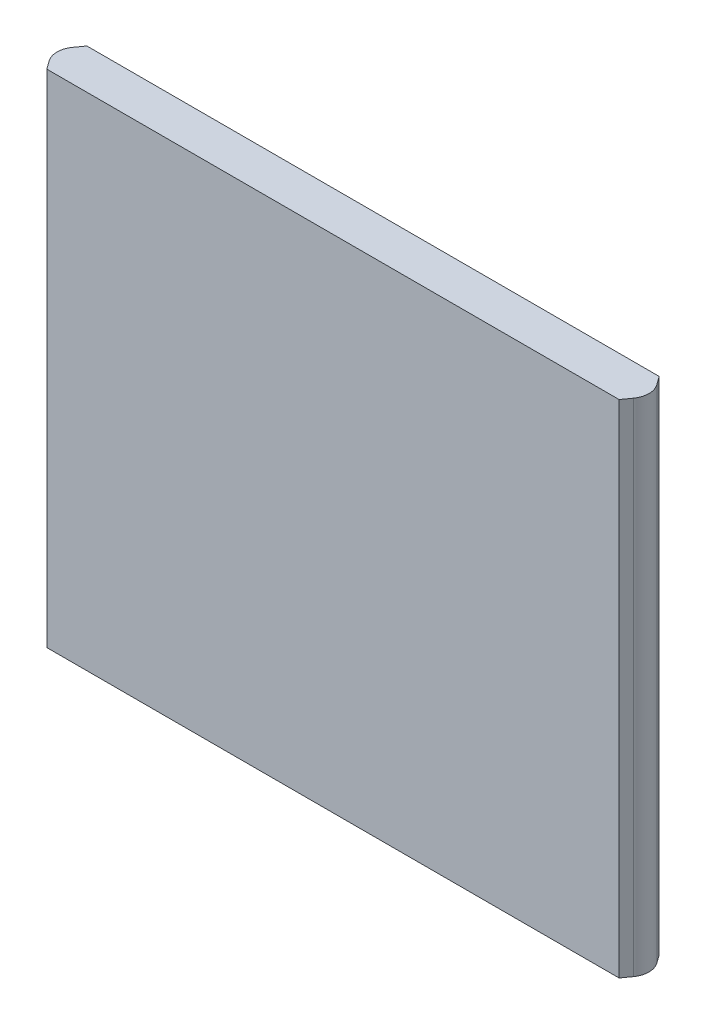
ISO-10303-21;
HEADER;
FILE_DESCRIPTION(('STEP AP214'),'2;1');
FILE_NAME('part.step','',(''),(''),'','','');
FILE_SCHEMA(('AUTOMOTIVE_DESIGN { 1 0 10303 214 1 1 1 1 }'));
ENDSEC;
DATA;
#1=APPLICATION_CONTEXT('core data for automotive mechanical design processes');
#2=APPLICATION_PROTOCOL_DEFINITION('international standard','automotive_design',2000,#1);
#3=PRODUCT_CONTEXT('',#1,'mechanical');
#4=PRODUCT('Part','Part','',(#3));
#5=PRODUCT_RELATED_PRODUCT_CATEGORY('part','',(#4));
#6=PRODUCT_DEFINITION_FORMATION('','',#4);
#7=PRODUCT_DEFINITION_CONTEXT('part definition',#1,'design');
#8=PRODUCT_DEFINITION('design','',#6,#7);
#9=PRODUCT_DEFINITION_SHAPE('','',#8);
#10=(LENGTH_UNIT() NAMED_UNIT(*) SI_UNIT(.MILLI.,.METRE.));
#11=(NAMED_UNIT(*) PLANE_ANGLE_UNIT() SI_UNIT($,.RADIAN.));
#12=(NAMED_UNIT(*) SI_UNIT($,.STERADIAN.) SOLID_ANGLE_UNIT());
#13=UNCERTAINTY_MEASURE_WITH_UNIT(LENGTH_MEASURE(1.E-05),#10,'distance_accuracy_value','');
#14=(GEOMETRIC_REPRESENTATION_CONTEXT(3) GLOBAL_UNCERTAINTY_ASSIGNED_CONTEXT((#13)) GLOBAL_UNIT_ASSIGNED_CONTEXT((#10,
#11,#12)) REPRESENTATION_CONTEXT('',''));
#15=CARTESIAN_POINT('',(0.,0.,0.));
#16=DIRECTION('',(0.,0.,1.));
#17=DIRECTION('',(1.,0.,0.));
#18=AXIS2_PLACEMENT_3D('',#15,#16,#17);
#19=CARTESIAN_POINT('',(30.,0.,2.));
#20=DIRECTION('',(0.,-1.,0.));
#21=DIRECTION('',(0.,0.,-1.));
#22=AXIS2_PLACEMENT_3D('',#19,#20,#21);
#23=PLANE('',#22);
#24=CARTESIAN_POINT('',(1.23350870842149,0.,1.));
#25=DIRECTION('',(0.,1.,0.));
#26=DIRECTION('',(0.,0.,1.));
#27=AXIS2_PLACEMENT_3D('',#24,#25,#26);
#28=CIRCLE('',#27,1.);
#29=CARTESIAN_POINT('',(0.422813175286831,0.,0.414532022604554));
#30=VERTEX_POINT('',#29);
#31=CARTESIAN_POINT('',(0.422813175286831,0.,1.58546797739545));
#32=VERTEX_POINT('',#31);
#33=EDGE_CURVE('E109',#30,#32,#28,.T.);
#34=ORIENTED_EDGE('',*,*,#33,.T.);
#35=DIRECTION('',(0.585467977395446,0.,0.810695533134657));
#36=VECTOR('',#35,1.);
#37=CARTESIAN_POINT('',(0.422813175286831,0.,1.58546797739545));
#38=LINE('',#37,#36);
#39=CARTESIAN_POINT('',(0.722179848619197,0.,2.));
#40=VERTEX_POINT('',#39);
#41=EDGE_CURVE('E114',#32,#40,#38,.T.);
#42=ORIENTED_EDGE('',*,*,#41,.T.);
#43=DIRECTION('',(-1.,0.,0.));
#44=VECTOR('',#43,1.);
#45=CARTESIAN_POINT('',(30.,0.,2.));
#46=LINE('',#45,#44);
#47=CARTESIAN_POINT('',(29.2778201513808,0.,2.));
#48=VERTEX_POINT('',#47);
#49=EDGE_CURVE('E41',#48,#40,#46,.T.);
#50=ORIENTED_EDGE('',*,*,#49,.F.);
#51=DIRECTION('',(0.585467977395448,0.,-0.810695533134656));
#52=VECTOR('',#51,1.);
#53=CARTESIAN_POINT('',(29.5771868247132,0.,1.58546797739545));
#54=LINE('',#53,#52);
#55=CARTESIAN_POINT('',(29.5771868247132,0.,1.58546797739545));
#56=VERTEX_POINT('',#55);
#57=EDGE_CURVE('E137',#48,#56,#54,.T.);
#58=ORIENTED_EDGE('',*,*,#57,.T.);
#59=CARTESIAN_POINT('',(28.7664912915785,0.,1.));
#60=DIRECTION('',(0.,1.,0.));
#61=DIRECTION('',(0.,0.,-1.));
#62=AXIS2_PLACEMENT_3D('',#59,#60,#61);
#63=CIRCLE('',#62,1.);
#64=CARTESIAN_POINT('',(29.5771868247132,0.,0.414532022604554));
#65=VERTEX_POINT('',#64);
#66=EDGE_CURVE('E140',#56,#65,#63,.T.);
#67=ORIENTED_EDGE('',*,*,#66,.T.);
#68=DIRECTION('',(-0.585467977395448,0.,-0.810695533134656));
#69=VECTOR('',#68,1.);
#70=CARTESIAN_POINT('',(29.5771868247132,0.,0.414532022604554));
#71=LINE('',#70,#69);
#72=CARTESIAN_POINT('',(29.2778201513808,0.,0.));
#73=VERTEX_POINT('',#72);
#74=EDGE_CURVE('E143',#65,#73,#71,.T.);
#75=ORIENTED_EDGE('',*,*,#74,.T.);
#76=DIRECTION('',(-1.,0.,0.));
#77=VECTOR('',#76,1.);
#78=CARTESIAN_POINT('',(30.,0.,0.));
#79=LINE('',#78,#77);
#80=CARTESIAN_POINT('',(0.722179848619203,0.,0.));
#81=VERTEX_POINT('',#80);
#82=EDGE_CURVE('E119',#73,#81,#79,.T.);
#83=ORIENTED_EDGE('',*,*,#82,.T.);
#84=DIRECTION('',(-0.585467977395446,0.,0.810695533134656));
#85=VECTOR('',#84,1.);
#86=CARTESIAN_POINT('',(0.422813175286831,0.,0.414532022604554));
#87=LINE('',#86,#85);
#88=EDGE_CURVE('E57',#81,#30,#87,.T.);
#89=ORIENTED_EDGE('',*,*,#88,.T.);
#90=EDGE_LOOP('',(#34,#42,#50,#58,#67,#75,#83,#89));
#91=FACE_BOUND('',#90,.T.);
#92=ADVANCED_FACE('F33',(#91),#23,.F.);
#93=CARTESIAN_POINT('',(0.,-25.,2.));
#94=DIRECTION('',(0.,1.,0.));
#95=DIRECTION('',(0.,0.,1.));
#96=AXIS2_PLACEMENT_3D('',#93,#94,#95);
#97=PLANE('',#96);
#98=CARTESIAN_POINT('',(15.,-25.,1.));
#99=DIRECTION('',(0.,-1.,0.));
#100=DIRECTION('',(0.,0.,-1.));
#101=AXIS2_PLACEMENT_3D('',#98,#99,#100);
#102=CIRCLE('',#101,0.3);
#103=CARTESIAN_POINT('',(15.,-25.,0.7));
#104=VERTEX_POINT('',#103);
#105=EDGE_CURVE('E125',#104,#104,#102,.T.);
#106=ORIENTED_EDGE('',*,*,#105,.F.);
#107=EDGE_LOOP('',(#106));
#108=FACE_BOUND('',#107,.T.);
#109=DIRECTION('',(1.,0.,0.));
#110=VECTOR('',#109,1.);
#111=CARTESIAN_POINT('',(0.,-25.,2.));
#112=LINE('',#111,#110);
#113=CARTESIAN_POINT('',(0.722179848619197,-25.,2.));
#114=VERTEX_POINT('',#113);
#115=CARTESIAN_POINT('',(29.2778201513808,-25.,2.));
#116=VERTEX_POINT('',#115);
#117=EDGE_CURVE('E11',#114,#116,#112,.T.);
#118=ORIENTED_EDGE('',*,*,#117,.F.);
#119=DIRECTION('',(0.585467977395446,0.,0.810695533134657));
#120=VECTOR('',#119,1.);
#121=CARTESIAN_POINT('',(0.422813175286831,-25.,1.58546797739545));
#122=LINE('',#121,#120);
#123=CARTESIAN_POINT('',(0.422813175286831,-25.,1.58546797739545));
#124=VERTEX_POINT('',#123);
#125=EDGE_CURVE('E120',#124,#114,#122,.T.);
#126=ORIENTED_EDGE('',*,*,#125,.F.);
#127=CARTESIAN_POINT('',(1.23350870842149,-25.,1.));
#128=DIRECTION('',(0.,1.,0.));
#129=DIRECTION('',(0.,0.,1.));
#130=AXIS2_PLACEMENT_3D('',#127,#128,#129);
#131=CIRCLE('',#130,1.);
#132=CARTESIAN_POINT('',(0.422813175286831,-25.,0.414532022604554));
#133=VERTEX_POINT('',#132);
#134=EDGE_CURVE('E122',#133,#124,#131,.T.);
#135=ORIENTED_EDGE('',*,*,#134,.F.);
#136=DIRECTION('',(-0.585467977395446,0.,0.810695533134656));
#137=VECTOR('',#136,1.);
#138=CARTESIAN_POINT('',(0.422813175286831,-25.,0.414532022604554));
#139=LINE('',#138,#137);
#140=CARTESIAN_POINT('',(0.722179848619197,-25.,0.));
#141=VERTEX_POINT('',#140);
#142=EDGE_CURVE('E101',#141,#133,#139,.T.);
#143=ORIENTED_EDGE('',*,*,#142,.F.);
#144=DIRECTION('',(1.,0.,0.));
#145=VECTOR('',#144,1.);
#146=CARTESIAN_POINT('',(0.,-25.,0.));
#147=LINE('',#146,#145);
#148=CARTESIAN_POINT('',(29.2778201513808,-25.,0.));
#149=VERTEX_POINT('',#148);
#150=EDGE_CURVE('E36',#141,#149,#147,.T.);
#151=ORIENTED_EDGE('',*,*,#150,.T.);
#152=DIRECTION('',(-0.585467977395448,0.,-0.810695533134656));
#153=VECTOR('',#152,1.);
#154=CARTESIAN_POINT('',(29.5771868247132,-25.,0.414532022604554));
#155=LINE('',#154,#153);
#156=CARTESIAN_POINT('',(29.5771868247132,-25.,0.414532022604554));
#157=VERTEX_POINT('',#156);
#158=EDGE_CURVE('E49',#157,#149,#155,.T.);
#159=ORIENTED_EDGE('',*,*,#158,.F.);
#160=CARTESIAN_POINT('',(28.7664912915785,-25.,1.));
#161=DIRECTION('',(0.,1.,0.));
#162=DIRECTION('',(0.,0.,-1.));
#163=AXIS2_PLACEMENT_3D('',#160,#161,#162);
#164=CIRCLE('',#163,1.);
#165=CARTESIAN_POINT('',(29.5771868247132,-25.,1.58546797739545));
#166=VERTEX_POINT('',#165);
#167=EDGE_CURVE('E149',#166,#157,#164,.T.);
#168=ORIENTED_EDGE('',*,*,#167,.F.);
#169=DIRECTION('',(0.585467977395448,0.,-0.810695533134656));
#170=VECTOR('',#169,1.);
#171=CARTESIAN_POINT('',(29.5771868247132,-25.,1.58546797739545));
#172=LINE('',#171,#170);
#173=EDGE_CURVE('E146',#116,#166,#172,.T.);
#174=ORIENTED_EDGE('',*,*,#173,.F.);
#175=EDGE_LOOP('',(#118,#126,#135,#143,#151,#159,#168,#174));
#176=FACE_BOUND('',#175,.T.);
#177=ADVANCED_FACE('F165',(#108,#176),#97,.F.);
#178=CARTESIAN_POINT('',(0.,0.,2.));
#179=DIRECTION('',(0.,0.,1.));
#180=DIRECTION('',(1.,0.,0.));
#181=AXIS2_PLACEMENT_3D('',#178,#179,#180);
#182=PLANE('',#181);
#183=DIRECTION('',(0.,-1.,0.));
#184=VECTOR('',#183,1.);
#185=CARTESIAN_POINT('',(0.722179848619197,0.,2.));
#186=LINE('',#185,#184);
#187=EDGE_CURVE('E132',#40,#114,#186,.T.);
#188=ORIENTED_EDGE('',*,*,#187,.T.);
#189=ORIENTED_EDGE('',*,*,#117,.T.);
#190=DIRECTION('',(0.,-1.,0.));
#191=VECTOR('',#190,1.);
#192=CARTESIAN_POINT('',(29.2778201513808,0.,2.));
#193=LINE('',#192,#191);
#194=EDGE_CURVE('E145',#48,#116,#193,.T.);
#195=ORIENTED_EDGE('',*,*,#194,.F.);
#196=ORIENTED_EDGE('',*,*,#49,.T.);
#197=EDGE_LOOP('',(#188,#189,#195,#196));
#198=FACE_BOUND('',#197,.T.);
#199=ADVANCED_FACE('F180',(#198),#182,.T.);
#200=CARTESIAN_POINT('',(0.,0.,0.));
#201=DIRECTION('',(0.,0.,1.));
#202=DIRECTION('',(1.,0.,0.));
#203=AXIS2_PLACEMENT_3D('',#200,#201,#202);
#204=PLANE('',#203);
#205=ORIENTED_EDGE('',*,*,#150,.F.);
#206=DIRECTION('',(0.,-1.,0.));
#207=VECTOR('',#206,1.);
#208=CARTESIAN_POINT('',(0.722179848619197,0.,0.));
#209=LINE('',#208,#207);
#210=EDGE_CURVE('E106',#81,#141,#209,.T.);
#211=ORIENTED_EDGE('',*,*,#210,.F.);
#212=ORIENTED_EDGE('',*,*,#82,.F.);
#213=DIRECTION('',(0.,-1.,0.));
#214=VECTOR('',#213,1.);
#215=CARTESIAN_POINT('',(29.2778201513808,0.,0.));
#216=LINE('',#215,#214);
#217=EDGE_CURVE('E130',#73,#149,#216,.T.);
#218=ORIENTED_EDGE('',*,*,#217,.T.);
#219=EDGE_LOOP('',(#205,#211,#212,#218));
#220=FACE_BOUND('',#219,.T.);
#221=ADVANCED_FACE('F168',(#220),#204,.F.);
#222=CARTESIAN_POINT('',(29.5771868247132,0.,0.414532022604554));
#223=DIRECTION('',(-0.810695533134656,0.,0.585467977395448));
#224=DIRECTION('',(0.585467977395448,0.,0.810695533134656));
#225=AXIS2_PLACEMENT_3D('',#222,#223,#224);
#226=PLANE('',#225);
#227=ORIENTED_EDGE('',*,*,#158,.T.);
#228=ORIENTED_EDGE('',*,*,#217,.F.);
#229=ORIENTED_EDGE('',*,*,#74,.F.);
#230=DIRECTION('',(0.,-1.,0.));
#231=VECTOR('',#230,1.);
#232=CARTESIAN_POINT('',(29.5771868247132,0.,0.414532022604554));
#233=LINE('',#232,#231);
#234=EDGE_CURVE('E155',#65,#157,#233,.T.);
#235=ORIENTED_EDGE('',*,*,#234,.T.);
#236=EDGE_LOOP('',(#227,#228,#229,#235));
#237=FACE_BOUND('',#236,.T.);
#238=ADVANCED_FACE('F170',(#237),#226,.F.);
#239=CARTESIAN_POINT('',(28.7664912915785,0.,1.));
#240=DIRECTION('',(0.,-1.,0.));
#241=DIRECTION('',(0.,0.,-1.));
#242=AXIS2_PLACEMENT_3D('',#239,#240,#241);
#243=CYLINDRICAL_SURFACE('',#242,1.);
#244=ORIENTED_EDGE('',*,*,#167,.T.);
#245=ORIENTED_EDGE('',*,*,#234,.F.);
#246=ORIENTED_EDGE('',*,*,#66,.F.);
#247=DIRECTION('',(0.,-1.,0.));
#248=VECTOR('',#247,1.);
#249=CARTESIAN_POINT('',(29.5771868247132,0.,1.58546797739545));
#250=LINE('',#249,#248);
#251=EDGE_CURVE('E157',#56,#166,#250,.T.);
#252=ORIENTED_EDGE('',*,*,#251,.T.);
#253=EDGE_LOOP('',(#244,#245,#246,#252));
#254=FACE_BOUND('',#253,.T.);
#255=ADVANCED_FACE('F174',(#254),#243,.T.);
#256=CARTESIAN_POINT('',(29.5771868247132,0.,1.58546797739545));
#257=DIRECTION('',(-0.810695533134656,0.,-0.585467977395448));
#258=DIRECTION('',(-0.585467977395448,0.,0.810695533134656));
#259=AXIS2_PLACEMENT_3D('',#256,#257,#258);
#260=PLANE('',#259);
#261=ORIENTED_EDGE('',*,*,#173,.T.);
#262=ORIENTED_EDGE('',*,*,#251,.F.);
#263=ORIENTED_EDGE('',*,*,#57,.F.);
#264=ORIENTED_EDGE('',*,*,#194,.T.);
#265=EDGE_LOOP('',(#261,#262,#263,#264));
#266=FACE_BOUND('',#265,.T.);
#267=ADVANCED_FACE('F184',(#266),#260,.F.);
#268=CARTESIAN_POINT('',(0.422813175286831,0.,1.58546797739545));
#269=DIRECTION('',(0.810695533134657,0.,-0.585467977395446));
#270=DIRECTION('',(-0.585467977395446,0.,-0.810695533134657));
#271=AXIS2_PLACEMENT_3D('',#268,#269,#270);
#272=PLANE('',#271);
#273=ORIENTED_EDGE('',*,*,#125,.T.);
#274=ORIENTED_EDGE('',*,*,#187,.F.);
#275=ORIENTED_EDGE('',*,*,#41,.F.);
#276=DIRECTION('',(0.,-1.,0.));
#277=VECTOR('',#276,1.);
#278=CARTESIAN_POINT('',(0.422813175286831,0.,1.58546797739545));
#279=LINE('',#278,#277);
#280=EDGE_CURVE('E105',#32,#124,#279,.T.);
#281=ORIENTED_EDGE('',*,*,#280,.T.);
#282=EDGE_LOOP('',(#273,#274,#275,#281));
#283=FACE_BOUND('',#282,.T.);
#284=ADVANCED_FACE('F182',(#283),#272,.F.);
#285=CARTESIAN_POINT('',(1.23350870842149,0.,1.));
#286=DIRECTION('',(0.,-1.,0.));
#287=DIRECTION('',(0.,0.,-1.));
#288=AXIS2_PLACEMENT_3D('',#285,#286,#287);
#289=CYLINDRICAL_SURFACE('',#288,1.);
#290=ORIENTED_EDGE('',*,*,#134,.T.);
#291=ORIENTED_EDGE('',*,*,#280,.F.);
#292=ORIENTED_EDGE('',*,*,#33,.F.);
#293=DIRECTION('',(0.,-1.,0.));
#294=VECTOR('',#293,1.);
#295=CARTESIAN_POINT('',(0.422813175286831,0.,0.414532022604554));
#296=LINE('',#295,#294);
#297=EDGE_CURVE('E97',#30,#133,#296,.T.);
#298=ORIENTED_EDGE('',*,*,#297,.T.);
#299=EDGE_LOOP('',(#290,#291,#292,#298));
#300=FACE_BOUND('',#299,.T.);
#301=ADVANCED_FACE('F110',(#300),#289,.T.);
#302=CARTESIAN_POINT('',(0.422813175286831,0.,0.414532022604554));
#303=DIRECTION('',(0.810695533134657,0.,0.585467977395446));
#304=DIRECTION('',(0.585467977395446,0.,-0.810695533134657));
#305=AXIS2_PLACEMENT_3D('',#302,#303,#304);
#306=PLANE('',#305);
#307=ORIENTED_EDGE('',*,*,#142,.T.);
#308=ORIENTED_EDGE('',*,*,#297,.F.);
#309=ORIENTED_EDGE('',*,*,#88,.F.);
#310=ORIENTED_EDGE('',*,*,#210,.T.);
#311=EDGE_LOOP('',(#307,#308,#309,#310));
#312=FACE_BOUND('',#311,.T.);
#313=ADVANCED_FACE('F99',(#312),#306,.F.);
#314=CARTESIAN_POINT('',(15.,-22.,1.));
#315=DIRECTION('',(0.,-1.,0.));
#316=DIRECTION('',(0.,0.,-1.));
#317=AXIS2_PLACEMENT_3D('',#314,#315,#316);
#318=CYLINDRICAL_SURFACE('',#317,0.3);
#319=CARTESIAN_POINT('',(15.,-22.,1.));
#320=DIRECTION('',(0.,-1.,0.));
#321=DIRECTION('',(0.,0.,-1.));
#322=AXIS2_PLACEMENT_3D('',#319,#320,#321);
#323=CIRCLE('',#322,0.3);
#324=CARTESIAN_POINT('',(15.,-22.,0.7));
#325=VERTEX_POINT('',#324);
#326=EDGE_CURVE('E150',#325,#325,#323,.T.);
#327=ORIENTED_EDGE('',*,*,#326,.F.);
#328=EDGE_LOOP('',(#327));
#329=FACE_BOUND('',#328,.T.);
#330=ORIENTED_EDGE('',*,*,#105,.T.);
#331=EDGE_LOOP('',(#330));
#332=FACE_BOUND('',#331,.T.);
#333=ADVANCED_FACE('F211',(#329,#332),#318,.F.);
#334=CARTESIAN_POINT('',(0.,-22.,0.));
#335=DIRECTION('',(0.,-1.,0.));
#336=DIRECTION('',(0.,0.,-1.));
#337=AXIS2_PLACEMENT_3D('',#334,#335,#336);
#338=PLANE('',#337);
#339=ORIENTED_EDGE('',*,*,#326,.T.);
#340=EDGE_LOOP('',(#339));
#341=FACE_BOUND('',#340,.T.);
#342=ADVANCED_FACE('F215',(#341),#338,.T.);
#343=CLOSED_SHELL('',(#92,#177,#199,#221,#238,#255,#267,#284,#301,#313,#333,#342));
#344=MANIFOLD_SOLID_BREP('B2',#343);
#345=ADVANCED_BREP_SHAPE_REPRESENTATION('',(#18,#344),#14);
#346=SHAPE_DEFINITION_REPRESENTATION(#9,#345);
ENDSEC;
END-ISO-10303-21;
